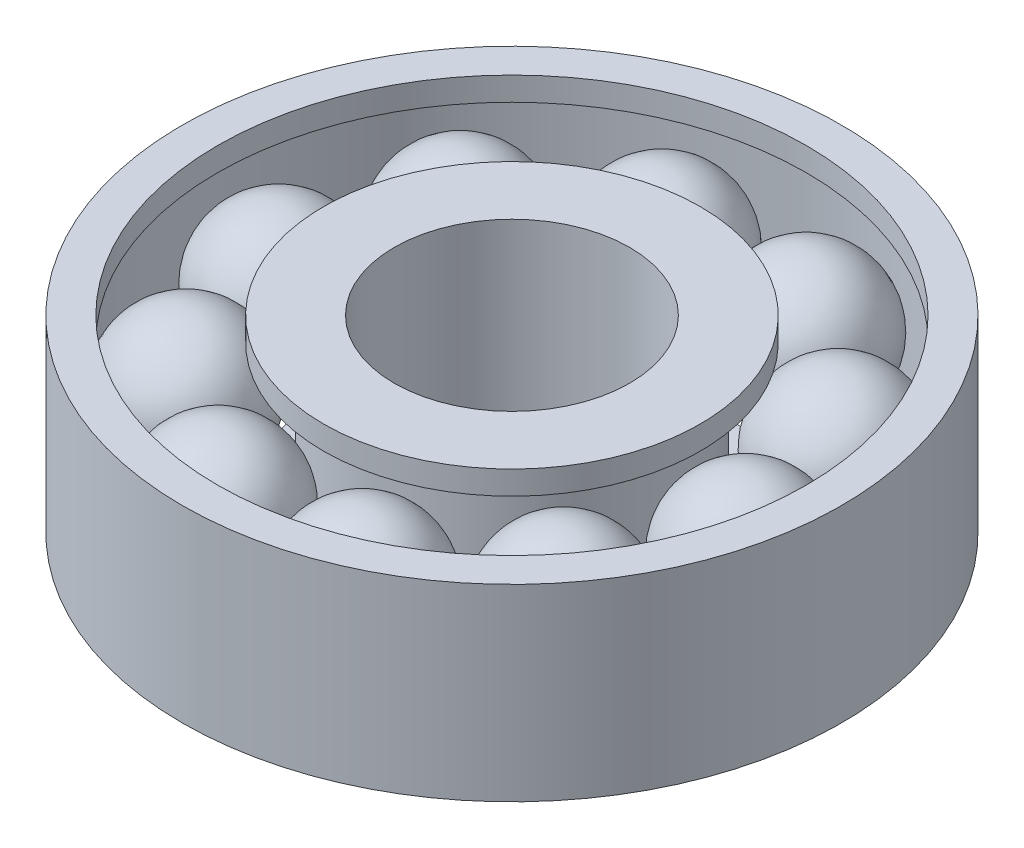
ISO-10303-21;
HEADER;
FILE_DESCRIPTION(('STEP AP214'),'2;1');
FILE_NAME('part.step','',(''),(''),'','','');
FILE_SCHEMA(('AUTOMOTIVE_DESIGN { 1 0 10303 214 1 1 1 1 }'));
ENDSEC;
DATA;
#1=APPLICATION_CONTEXT('core data for automotive mechanical design processes');
#2=APPLICATION_PROTOCOL_DEFINITION('international standard','automotive_design',2000,#1);
#3=PRODUCT_CONTEXT('',#1,'mechanical');
#4=PRODUCT('Part','Part','',(#3));
#5=PRODUCT_RELATED_PRODUCT_CATEGORY('part','',(#4));
#6=PRODUCT_DEFINITION_FORMATION('','',#4);
#7=PRODUCT_DEFINITION_CONTEXT('part definition',#1,'design');
#8=PRODUCT_DEFINITION('design','',#6,#7);
#9=PRODUCT_DEFINITION_SHAPE('','',#8);
#10=(LENGTH_UNIT() NAMED_UNIT(*) SI_UNIT(.MILLI.,.METRE.));
#11=(NAMED_UNIT(*) PLANE_ANGLE_UNIT() SI_UNIT($,.RADIAN.));
#12=(NAMED_UNIT(*) SI_UNIT($,.STERADIAN.) SOLID_ANGLE_UNIT());
#13=UNCERTAINTY_MEASURE_WITH_UNIT(LENGTH_MEASURE(1.E-05),#10,'distance_accuracy_value','');
#14=(GEOMETRIC_REPRESENTATION_CONTEXT(3) GLOBAL_UNCERTAINTY_ASSIGNED_CONTEXT((#13)) GLOBAL_UNIT_ASSIGNED_CONTEXT((#10,
#11,#12)) REPRESENTATION_CONTEXT('',''));
#15=CARTESIAN_POINT('',(0.,0.,0.));
#16=DIRECTION('',(0.,0.,1.));
#17=DIRECTION('',(1.,0.,0.));
#18=AXIS2_PLACEMENT_3D('',#15,#16,#17);
#19=CARTESIAN_POINT('',(8.01957198147729,7.20884205016558,-5.82656010094331));
#20=DIRECTION('',(0.,1.,0.));
#21=DIRECTION('',(0.809016994374955,0.,-0.587785252292462));
#22=AXIS2_PLACEMENT_3D('',#19,#20,#21);
#23=SPHERICAL_SURFACE('',#22,3.);
#24=CARTESIAN_POINT('',(8.01957198147729,10.2088420501656,-5.82656010094331));
#25=VERTEX_POINT('',#24);
#26=VERTEX_LOOP('',#25);
#27=FACE_BOUND('',#26,.T.);
#28=ADVANCED_FACE('F58',(#27),#23,.T.);
#29=CLOSED_SHELL('',(#28));
#30=MANIFOLD_SOLID_BREP('B2',#29);
#31=CARTESIAN_POINT('',(3.06320392169806,7.20884205016558,-9.42757228082043));
#32=DIRECTION('',(0.,1.,0.));
#33=DIRECTION('',(0.309016994374958,0.,-0.95105651629515));
#34=AXIS2_PLACEMENT_3D('',#31,#32,#33);
#35=SPHERICAL_SURFACE('',#34,3.);
#36=CARTESIAN_POINT('',(3.06320392169806,10.2088420501656,-9.42757228082043));
#37=VERTEX_POINT('',#36);
#38=VERTEX_LOOP('',#37);
#39=FACE_BOUND('',#38,.T.);
#40=ADVANCED_FACE('F83',(#39),#35,.T.);
#41=CLOSED_SHELL('',(#40));
#42=MANIFOLD_SOLID_BREP('B6',#41);
#43=CARTESIAN_POINT('',(-3.06320392169786,7.20884205016558,-9.42757228082049));
#44=DIRECTION('',(0.,1.,0.));
#45=DIRECTION('',(-0.309016994374938,0.,-0.951056516295157));
#46=AXIS2_PLACEMENT_3D('',#43,#44,#45);
#47=SPHERICAL_SURFACE('',#46,3.);
#48=CARTESIAN_POINT('',(-3.06320392169786,10.2088420501656,-9.42757228082049));
#49=VERTEX_POINT('',#48);
#50=VERTEX_LOOP('',#49);
#51=FACE_BOUND('',#50,.T.);
#52=ADVANCED_FACE('F108',(#51),#47,.T.);
#53=CLOSED_SHELL('',(#52));
#54=MANIFOLD_SOLID_BREP('B54',#53);
#55=CARTESIAN_POINT('',(-8.01957198147716,7.20884205016558,-5.82656010094349));
#56=DIRECTION('',(0.,1.,0.));
#57=DIRECTION('',(-0.809016994374942,0.,-0.58778525229248));
#58=AXIS2_PLACEMENT_3D('',#55,#56,#57);
#59=SPHERICAL_SURFACE('',#58,3.);
#60=CARTESIAN_POINT('',(-8.01957198147716,10.2088420501656,-5.82656010094349));
#61=VERTEX_POINT('',#60);
#62=VERTEX_LOOP('',#61);
#63=FACE_BOUND('',#62,.T.);
#64=ADVANCED_FACE('F133',(#63),#59,.T.);
#65=CLOSED_SHELL('',(#64));
#66=MANIFOLD_SOLID_BREP('B79',#65);
#67=CARTESIAN_POINT('',(-9.91273611955852,7.20884205016558,0.));
#68=DIRECTION('',(0.,1.,0.));
#69=DIRECTION('',(-1.,0.,0.));
#70=AXIS2_PLACEMENT_3D('',#67,#68,#69);
#71=SPHERICAL_SURFACE('',#70,3.);
#72=CARTESIAN_POINT('',(-9.91273611955852,10.2088420501656,0.));
#73=VERTEX_POINT('',#72);
#74=VERTEX_LOOP('',#73);
#75=FACE_BOUND('',#74,.T.);
#76=ADVANCED_FACE('F158',(#75),#71,.T.);
#77=CLOSED_SHELL('',(#76));
#78=MANIFOLD_SOLID_BREP('B104',#77);
#79=CARTESIAN_POINT('',(-8.01957198147725,7.20884205016558,5.82656010094337));
#80=DIRECTION('',(0.,1.,0.));
#81=DIRECTION('',(-0.809016994374951,0.,0.587785252292469));
#82=AXIS2_PLACEMENT_3D('',#79,#80,#81);
#83=SPHERICAL_SURFACE('',#82,3.);
#84=CARTESIAN_POINT('',(-8.01957198147725,10.2088420501656,5.82656010094337));
#85=VERTEX_POINT('',#84);
#86=VERTEX_LOOP('',#85);
#87=FACE_BOUND('',#86,.T.);
#88=ADVANCED_FACE('F183',(#87),#83,.T.);
#89=CLOSED_SHELL('',(#88));
#90=MANIFOLD_SOLID_BREP('B129',#89);
#91=CARTESIAN_POINT('',(-3.06320392169799,7.20884205016558,9.42757228082045));
#92=DIRECTION('',(0.,1.,0.));
#93=DIRECTION('',(-0.309016994374952,0.,0.951056516295152));
#94=AXIS2_PLACEMENT_3D('',#91,#92,#93);
#95=SPHERICAL_SURFACE('',#94,3.);
#96=CARTESIAN_POINT('',(-3.06320392169799,10.2088420501656,9.42757228082045));
#97=VERTEX_POINT('',#96);
#98=VERTEX_LOOP('',#97);
#99=FACE_BOUND('',#98,.T.);
#100=ADVANCED_FACE('F208',(#99),#95,.T.);
#101=CLOSED_SHELL('',(#100));
#102=MANIFOLD_SOLID_BREP('B154',#101);
#103=CARTESIAN_POINT('',(3.06320392169793,7.20884205016558,9.42757228082047));
#104=DIRECTION('',(0.,1.,0.));
#105=DIRECTION('',(0.309016994374945,0.,0.951056516295155));
#106=AXIS2_PLACEMENT_3D('',#103,#104,#105);
#107=SPHERICAL_SURFACE('',#106,3.);
#108=CARTESIAN_POINT('',(3.06320392169793,10.2088420501656,9.42757228082047));
#109=VERTEX_POINT('',#108);
#110=VERTEX_LOOP('',#109);
#111=FACE_BOUND('',#110,.T.);
#112=ADVANCED_FACE('F233',(#111),#107,.T.);
#113=CLOSED_SHELL('',(#112));
#114=MANIFOLD_SOLID_BREP('B179',#113);
#115=CARTESIAN_POINT('',(8.01957198147721,7.20884205016558,5.82656010094343));
#116=DIRECTION('',(0.,1.,0.));
#117=DIRECTION('',(0.809016994374947,0.,0.587785252292474));
#118=AXIS2_PLACEMENT_3D('',#115,#116,#117);
#119=SPHERICAL_SURFACE('',#118,3.);
#120=CARTESIAN_POINT('',(8.01957198147721,10.2088420501656,5.82656010094343));
#121=VERTEX_POINT('',#120);
#122=VERTEX_LOOP('',#121);
#123=FACE_BOUND('',#122,.T.);
#124=ADVANCED_FACE('F258',(#123),#119,.T.);
#125=CLOSED_SHELL('',(#124));
#126=MANIFOLD_SOLID_BREP('B204',#125);
#127=CARTESIAN_POINT('',(9.91273611955852,7.20884205016558,0.));
#128=DIRECTION('',(0.,1.,0.));
#129=DIRECTION('',(1.,0.,0.));
#130=AXIS2_PLACEMENT_3D('',#127,#128,#129);
#131=SPHERICAL_SURFACE('',#130,3.);
#132=CARTESIAN_POINT('',(9.91273611955852,10.2088420501656,0.));
#133=VERTEX_POINT('',#132);
#134=VERTEX_LOOP('',#133);
#135=FACE_BOUND('',#134,.T.);
#136=ADVANCED_FACE('F285',(#135),#131,.T.);
#137=CLOSED_SHELL('',(#136));
#138=MANIFOLD_SOLID_BREP('B229',#137);
#139=CARTESIAN_POINT('',(0.,11.,0.));
#140=DIRECTION('',(0.,-1.,0.));
#141=DIRECTION('',(0.,0.,-1.));
#142=AXIS2_PLACEMENT_3D('',#139,#140,#141);
#143=CYLINDRICAL_SURFACE('',#142,8.);
#144=CARTESIAN_POINT('',(0.,11.,0.));
#145=DIRECTION('',(0.,1.,0.));
#146=DIRECTION('',(0.,0.,1.));
#147=AXIS2_PLACEMENT_3D('',#144,#145,#146);
#148=CIRCLE('',#147,8.);
#149=CARTESIAN_POINT('',(0.,11.,8.));
#150=VERTEX_POINT('',#149);
#151=EDGE_CURVE('E284',#150,#150,#148,.T.);
#152=ORIENTED_EDGE('',*,*,#151,.F.);
#153=EDGE_LOOP('',(#152));
#154=FACE_BOUND('',#153,.T.);
#155=CARTESIAN_POINT('',(0.,9.99999999999999,0.));
#156=DIRECTION('',(0.,-1.,0.));
#157=DIRECTION('',(0.,0.,-1.));
#158=AXIS2_PLACEMENT_3D('',#155,#156,#157);
#159=CIRCLE('',#158,8.);
#160=CARTESIAN_POINT('',(0.,9.99999999999999,-8.));
#161=VERTEX_POINT('',#160);
#162=EDGE_CURVE('E329',#161,#161,#159,.T.);
#163=ORIENTED_EDGE('',*,*,#162,.F.);
#164=EDGE_LOOP('',(#163));
#165=FACE_BOUND('',#164,.T.);
#166=ADVANCED_FACE('F311',(#154,#165),#143,.T.);
#167=CARTESIAN_POINT('',(0.,11.,0.));
#168=DIRECTION('',(0.,1.,0.));
#169=DIRECTION('',(0.,0.,1.));
#170=AXIS2_PLACEMENT_3D('',#167,#168,#169);
#171=PLANE('',#170);
#172=ORIENTED_EDGE('',*,*,#151,.T.);
#173=EDGE_LOOP('',(#172));
#174=FACE_BOUND('',#173,.T.);
#175=CARTESIAN_POINT('',(0.,11.,0.));
#176=DIRECTION('',(0.,1.,0.));
#177=DIRECTION('',(0.,0.,1.));
#178=AXIS2_PLACEMENT_3D('',#175,#176,#177);
#179=CIRCLE('',#178,5.);
#180=CARTESIAN_POINT('',(0.,11.,5.));
#181=VERTEX_POINT('',#180);
#182=EDGE_CURVE('E324',#181,#181,#179,.T.);
#183=ORIENTED_EDGE('',*,*,#182,.F.);
#184=EDGE_LOOP('',(#183));
#185=FACE_BOUND('',#184,.T.);
#186=ADVANCED_FACE('F365',(#174,#185),#171,.T.);
#187=CARTESIAN_POINT('',(0.,3.,0.));
#188=DIRECTION('',(0.,1.,0.));
#189=DIRECTION('',(0.,0.,1.));
#190=AXIS2_PLACEMENT_3D('',#187,#188,#189);
#191=PLANE('',#190);
#192=CARTESIAN_POINT('',(0.,3.,0.));
#193=DIRECTION('',(0.,1.,0.));
#194=DIRECTION('',(0.,0.,1.));
#195=AXIS2_PLACEMENT_3D('',#192,#193,#194);
#196=CIRCLE('',#195,8.);
#197=CARTESIAN_POINT('',(0.,3.,8.));
#198=VERTEX_POINT('',#197);
#199=EDGE_CURVE('E319',#198,#198,#196,.T.);
#200=ORIENTED_EDGE('',*,*,#199,.F.);
#201=EDGE_LOOP('',(#200));
#202=FACE_BOUND('',#201,.T.);
#203=CARTESIAN_POINT('',(0.,3.,0.));
#204=DIRECTION('',(0.,1.,0.));
#205=DIRECTION('',(0.,0.,1.));
#206=AXIS2_PLACEMENT_3D('',#203,#204,#205);
#207=CIRCLE('',#206,5.);
#208=CARTESIAN_POINT('',(0.,3.,5.));
#209=VERTEX_POINT('',#208);
#210=EDGE_CURVE('E327',#209,#209,#207,.T.);
#211=ORIENTED_EDGE('',*,*,#210,.T.);
#212=EDGE_LOOP('',(#211));
#213=FACE_BOUND('',#212,.T.);
#214=ADVANCED_FACE('F348',(#202,#213),#191,.F.);
#215=CARTESIAN_POINT('',(0.,3.99999999999999,0.));
#216=DIRECTION('',(0.,-1.,0.));
#217=DIRECTION('',(0.,0.,-1.));
#218=AXIS2_PLACEMENT_3D('',#215,#216,#217);
#219=CIRCLE('',#218,8.);
#220=CARTESIAN_POINT('',(0.,3.99999999999999,-8.));
#221=VERTEX_POINT('',#220);
#222=EDGE_CURVE('E315',#221,#221,#219,.T.);
#223=ORIENTED_EDGE('',*,*,#222,.T.);
#224=EDGE_LOOP('',(#223));
#225=FACE_BOUND('',#224,.T.);
#226=ORIENTED_EDGE('',*,*,#199,.T.);
#227=EDGE_LOOP('',(#226));
#228=FACE_BOUND('',#227,.T.);
#229=ADVANCED_FACE('F313',(#225,#228),#143,.T.);
#230=CARTESIAN_POINT('',(0.,11.,0.));
#231=DIRECTION('',(0.,-1.,0.));
#232=DIRECTION('',(0.,0.,-1.));
#233=AXIS2_PLACEMENT_3D('',#230,#231,#232);
#234=CYLINDRICAL_SURFACE('',#233,5.);
#235=ORIENTED_EDGE('',*,*,#182,.T.);
#236=EDGE_LOOP('',(#235));
#237=FACE_BOUND('',#236,.T.);
#238=ORIENTED_EDGE('',*,*,#210,.F.);
#239=EDGE_LOOP('',(#238));
#240=FACE_BOUND('',#239,.T.);
#241=ADVANCED_FACE('F350',(#237,#240),#234,.F.);
#242=CARTESIAN_POINT('',(0.,3.99999999999999,0.));
#243=DIRECTION('',(0.,-1.,0.));
#244=DIRECTION('',(0.,0.,-1.));
#245=AXIS2_PLACEMENT_3D('',#242,#243,#244);
#246=PLANE('',#245);
#247=CARTESIAN_POINT('',(0.,3.99999999999999,0.));
#248=DIRECTION('',(0.,1.,0.));
#249=DIRECTION('',(0.,0.,1.));
#250=AXIS2_PLACEMENT_3D('',#247,#248,#249);
#251=CIRCLE('',#250,6.5);
#252=CARTESIAN_POINT('',(0.,3.99999999999999,6.5));
#253=VERTEX_POINT('',#252);
#254=EDGE_CURVE('E331',#253,#253,#251,.T.);
#255=ORIENTED_EDGE('',*,*,#254,.F.);
#256=EDGE_LOOP('',(#255));
#257=FACE_BOUND('',#256,.T.);
#258=ORIENTED_EDGE('',*,*,#222,.F.);
#259=EDGE_LOOP('',(#258));
#260=FACE_BOUND('',#259,.T.);
#261=ADVANCED_FACE('F352',(#257,#260),#246,.F.);
#262=CARTESIAN_POINT('',(0.,9.99999999999999,0.));
#263=DIRECTION('',(0.,-1.,0.));
#264=DIRECTION('',(0.,0.,-1.));
#265=AXIS2_PLACEMENT_3D('',#262,#263,#264);
#266=PLANE('',#265);
#267=CARTESIAN_POINT('',(0.,9.99999999999999,0.));
#268=DIRECTION('',(0.,1.,0.));
#269=DIRECTION('',(0.,0.,1.));
#270=AXIS2_PLACEMENT_3D('',#267,#268,#269);
#271=CIRCLE('',#270,6.5);
#272=CARTESIAN_POINT('',(0.,9.99999999999999,6.5));
#273=VERTEX_POINT('',#272);
#274=EDGE_CURVE('E336',#273,#273,#271,.T.);
#275=ORIENTED_EDGE('',*,*,#274,.T.);
#276=EDGE_LOOP('',(#275));
#277=FACE_BOUND('',#276,.T.);
#278=ORIENTED_EDGE('',*,*,#162,.T.);
#279=EDGE_LOOP('',(#278));
#280=FACE_BOUND('',#279,.T.);
#281=ADVANCED_FACE('F359',(#277,#280),#266,.T.);
#282=CARTESIAN_POINT('',(0.,11.,0.));
#283=DIRECTION('',(0.,1.,0.));
#284=DIRECTION('',(0.,0.,1.));
#285=AXIS2_PLACEMENT_3D('',#282,#283,#284);
#286=CYLINDRICAL_SURFACE('',#285,6.5);
#287=ORIENTED_EDGE('',*,*,#274,.F.);
#288=EDGE_LOOP('',(#287));
#289=FACE_BOUND('',#288,.T.);
#290=ORIENTED_EDGE('',*,*,#254,.T.);
#291=EDGE_LOOP('',(#290));
#292=FACE_BOUND('',#291,.T.);
#293=ADVANCED_FACE('F412',(#289,#292),#286,.T.);
#294=CLOSED_SHELL('',(#166,#186,#214,#229,#241,#261,#281,#293));
#295=MANIFOLD_SOLID_BREP('B254',#294);
#296=CARTESIAN_POINT('',(0.,11.,0.));
#297=DIRECTION('',(0.,-1.,0.));
#298=DIRECTION('',(0.,0.,-1.));
#299=AXIS2_PLACEMENT_3D('',#296,#297,#298);
#300=CYLINDRICAL_SURFACE('',#299,12.5);
#301=CARTESIAN_POINT('',(0.,11.,0.));
#302=DIRECTION('',(0.,1.,0.));
#303=DIRECTION('',(0.,0.,1.));
#304=AXIS2_PLACEMENT_3D('',#301,#302,#303);
#305=CIRCLE('',#304,12.5);
#306=CARTESIAN_POINT('',(0.,11.,12.5));
#307=VERTEX_POINT('',#306);
#308=EDGE_CURVE('E447',#307,#307,#305,.T.);
#309=ORIENTED_EDGE('',*,*,#308,.T.);
#310=EDGE_LOOP('',(#309));
#311=FACE_BOUND('',#310,.T.);
#312=CARTESIAN_POINT('',(0.,9.99999999999999,0.));
#313=DIRECTION('',(0.,-1.,0.));
#314=DIRECTION('',(0.,0.,-1.));
#315=AXIS2_PLACEMENT_3D('',#312,#313,#314);
#316=CIRCLE('',#315,12.5);
#317=CARTESIAN_POINT('',(0.,9.99999999999999,-12.5));
#318=VERTEX_POINT('',#317);
#319=EDGE_CURVE('E452',#318,#318,#316,.T.);
#320=ORIENTED_EDGE('',*,*,#319,.T.);
#321=EDGE_LOOP('',(#320));
#322=FACE_BOUND('',#321,.T.);
#323=ADVANCED_FACE('F432',(#311,#322),#300,.F.);
#324=CARTESIAN_POINT('',(0.,11.,0.));
#325=DIRECTION('',(0.,1.,0.));
#326=DIRECTION('',(0.,0.,1.));
#327=AXIS2_PLACEMENT_3D('',#324,#325,#326);
#328=PLANE('',#327);
#329=CARTESIAN_POINT('',(0.,11.,0.));
#330=DIRECTION('',(0.,1.,0.));
#331=DIRECTION('',(0.,0.,1.));
#332=AXIS2_PLACEMENT_3D('',#329,#330,#331);
#333=CIRCLE('',#332,14.);
#334=CARTESIAN_POINT('',(0.,11.,14.));
#335=VERTEX_POINT('',#334);
#336=EDGE_CURVE('E310',#335,#335,#333,.T.);
#337=ORIENTED_EDGE('',*,*,#336,.T.);
#338=EDGE_LOOP('',(#337));
#339=FACE_BOUND('',#338,.T.);
#340=ORIENTED_EDGE('',*,*,#308,.F.);
#341=EDGE_LOOP('',(#340));
#342=FACE_BOUND('',#341,.T.);
#343=ADVANCED_FACE('F495',(#339,#342),#328,.T.);
#344=CARTESIAN_POINT('',(0.,3.,0.));
#345=DIRECTION('',(0.,1.,0.));
#346=DIRECTION('',(0.,0.,1.));
#347=AXIS2_PLACEMENT_3D('',#344,#345,#346);
#348=PLANE('',#347);
#349=CARTESIAN_POINT('',(0.,3.,0.));
#350=DIRECTION('',(0.,1.,0.));
#351=DIRECTION('',(0.,0.,1.));
#352=AXIS2_PLACEMENT_3D('',#349,#350,#351);
#353=CIRCLE('',#352,14.);
#354=CARTESIAN_POINT('',(0.,3.,14.));
#355=VERTEX_POINT('',#354);
#356=EDGE_CURVE('E441',#355,#355,#353,.T.);
#357=ORIENTED_EDGE('',*,*,#356,.F.);
#358=EDGE_LOOP('',(#357));
#359=FACE_BOUND('',#358,.T.);
#360=CARTESIAN_POINT('',(0.,3.,0.));
#361=DIRECTION('',(0.,1.,0.));
#362=DIRECTION('',(0.,0.,1.));
#363=AXIS2_PLACEMENT_3D('',#360,#361,#362);
#364=CIRCLE('',#363,12.5);
#365=CARTESIAN_POINT('',(0.,3.,12.5));
#366=VERTEX_POINT('',#365);
#367=EDGE_CURVE('E450',#366,#366,#364,.T.);
#368=ORIENTED_EDGE('',*,*,#367,.T.);
#369=EDGE_LOOP('',(#368));
#370=FACE_BOUND('',#369,.T.);
#371=ADVANCED_FACE('F477',(#359,#370),#348,.F.);
#372=CARTESIAN_POINT('',(0.,11.,0.));
#373=DIRECTION('',(0.,-1.,0.));
#374=DIRECTION('',(0.,0.,-1.));
#375=AXIS2_PLACEMENT_3D('',#372,#373,#374);
#376=CYLINDRICAL_SURFACE('',#375,14.);
#377=ORIENTED_EDGE('',*,*,#336,.F.);
#378=EDGE_LOOP('',(#377));
#379=FACE_BOUND('',#378,.T.);
#380=ORIENTED_EDGE('',*,*,#356,.T.);
#381=EDGE_LOOP('',(#380));
#382=FACE_BOUND('',#381,.T.);
#383=ADVANCED_FACE('F434',(#379,#382),#376,.T.);
#384=CARTESIAN_POINT('',(0.,3.99999999999999,0.));
#385=DIRECTION('',(0.,-1.,0.));
#386=DIRECTION('',(0.,0.,-1.));
#387=AXIS2_PLACEMENT_3D('',#384,#385,#386);
#388=CIRCLE('',#387,12.5);
#389=CARTESIAN_POINT('',(0.,3.99999999999999,-12.5));
#390=VERTEX_POINT('',#389);
#391=EDGE_CURVE('E436',#390,#390,#388,.T.);
#392=ORIENTED_EDGE('',*,*,#391,.F.);
#393=EDGE_LOOP('',(#392));
#394=FACE_BOUND('',#393,.T.);
#395=ORIENTED_EDGE('',*,*,#367,.F.);
#396=EDGE_LOOP('',(#395));
#397=FACE_BOUND('',#396,.T.);
#398=ADVANCED_FACE('F479',(#394,#397),#300,.F.);
#399=CARTESIAN_POINT('',(0.,3.99999999999999,0.));
#400=DIRECTION('',(0.,-1.,0.));
#401=DIRECTION('',(0.,0.,-1.));
#402=AXIS2_PLACEMENT_3D('',#399,#400,#401);
#403=PLANE('',#402);
#404=ORIENTED_EDGE('',*,*,#391,.T.);
#405=EDGE_LOOP('',(#404));
#406=FACE_BOUND('',#405,.T.);
#407=CARTESIAN_POINT('',(0.,3.99999999999999,0.));
#408=DIRECTION('',(0.,1.,0.));
#409=DIRECTION('',(0.,0.,1.));
#410=AXIS2_PLACEMENT_3D('',#407,#408,#409);
#411=CIRCLE('',#410,13.25);
#412=CARTESIAN_POINT('',(0.,3.99999999999999,13.25));
#413=VERTEX_POINT('',#412);
#414=EDGE_CURVE('E462',#413,#413,#411,.T.);
#415=ORIENTED_EDGE('',*,*,#414,.T.);
#416=EDGE_LOOP('',(#415));
#417=FACE_BOUND('',#416,.T.);
#418=ADVANCED_FACE('F481',(#406,#417),#403,.F.);
#419=CARTESIAN_POINT('',(0.,9.99999999999999,0.));
#420=DIRECTION('',(0.,-1.,0.));
#421=DIRECTION('',(0.,0.,-1.));
#422=AXIS2_PLACEMENT_3D('',#419,#420,#421);
#423=PLANE('',#422);
#424=ORIENTED_EDGE('',*,*,#319,.F.);
#425=EDGE_LOOP('',(#424));
#426=FACE_BOUND('',#425,.T.);
#427=CARTESIAN_POINT('',(0.,9.99999999999999,0.));
#428=DIRECTION('',(0.,1.,0.));
#429=DIRECTION('',(0.,0.,1.));
#430=AXIS2_PLACEMENT_3D('',#427,#428,#429);
#431=CIRCLE('',#430,13.25);
#432=CARTESIAN_POINT('',(0.,9.99999999999999,13.25));
#433=VERTEX_POINT('',#432);
#434=EDGE_CURVE('E455',#433,#433,#431,.T.);
#435=ORIENTED_EDGE('',*,*,#434,.F.);
#436=EDGE_LOOP('',(#435));
#437=FACE_BOUND('',#436,.T.);
#438=ADVANCED_FACE('F488',(#426,#437),#423,.T.);
#439=CARTESIAN_POINT('',(0.,11.,0.));
#440=DIRECTION('',(0.,1.,0.));
#441=DIRECTION('',(0.,0.,1.));
#442=AXIS2_PLACEMENT_3D('',#439,#440,#441);
#443=CYLINDRICAL_SURFACE('',#442,13.25);
#444=ORIENTED_EDGE('',*,*,#414,.F.);
#445=EDGE_LOOP('',(#444));
#446=FACE_BOUND('',#445,.T.);
#447=ORIENTED_EDGE('',*,*,#434,.T.);
#448=EDGE_LOOP('',(#447));
#449=FACE_BOUND('',#448,.T.);
#450=ADVANCED_FACE('F537',(#446,#449),#443,.F.);
#451=CLOSED_SHELL('',(#323,#343,#371,#383,#398,#418,#438,#450));
#452=MANIFOLD_SOLID_BREP('B279',#451);
#453=ADVANCED_BREP_SHAPE_REPRESENTATION('',(#18,#30,#42,#54,#66,#78,#90,#102,#114,#126,#138,
#295,#452),#14);
#454=SHAPE_DEFINITION_REPRESENTATION(#9,#453);
ENDSEC;
END-ISO-10303-21;
